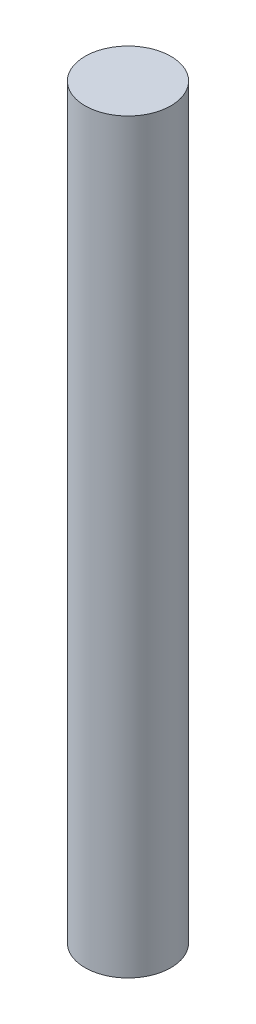
ISO-10303-21;
HEADER;
FILE_DESCRIPTION(('STEP AP214'),'2;1');
FILE_NAME('part.step','',(''),(''),'','','');
FILE_SCHEMA(('AUTOMOTIVE_DESIGN { 1 0 10303 214 1 1 1 1 }'));
ENDSEC;
DATA;
#1=APPLICATION_CONTEXT('core data for automotive mechanical design processes');
#2=APPLICATION_PROTOCOL_DEFINITION('international standard','automotive_design',2000,#1);
#3=PRODUCT_CONTEXT('',#1,'mechanical');
#4=PRODUCT('Part','Part','',(#3));
#5=PRODUCT_RELATED_PRODUCT_CATEGORY('part','',(#4));
#6=PRODUCT_DEFINITION_FORMATION('','',#4);
#7=PRODUCT_DEFINITION_CONTEXT('part definition',#1,'design');
#8=PRODUCT_DEFINITION('design','',#6,#7);
#9=PRODUCT_DEFINITION_SHAPE('','',#8);
#10=(LENGTH_UNIT() NAMED_UNIT(*) SI_UNIT(.MILLI.,.METRE.));
#11=(NAMED_UNIT(*) PLANE_ANGLE_UNIT() SI_UNIT($,.RADIAN.));
#12=(NAMED_UNIT(*) SI_UNIT($,.STERADIAN.) SOLID_ANGLE_UNIT());
#13=UNCERTAINTY_MEASURE_WITH_UNIT(LENGTH_MEASURE(1.E-05),#10,'distance_accuracy_value','');
#14=(GEOMETRIC_REPRESENTATION_CONTEXT(3) GLOBAL_UNCERTAINTY_ASSIGNED_CONTEXT((#13)) GLOBAL_UNIT_ASSIGNED_CONTEXT((#10,
#11,#12)) REPRESENTATION_CONTEXT('',''));
#15=CARTESIAN_POINT('',(0.,0.,0.));
#16=DIRECTION('',(0.,0.,1.));
#17=DIRECTION('',(1.,0.,0.));
#18=AXIS2_PLACEMENT_3D('',#15,#16,#17);
#19=CARTESIAN_POINT('',(0.,87.,0.));
#20=DIRECTION('',(0.,-1.,0.));
#21=DIRECTION('',(0.,0.,-1.));
#22=AXIS2_PLACEMENT_3D('',#19,#20,#21);
#23=CYLINDRICAL_SURFACE('',#22,5.);
#24=CARTESIAN_POINT('',(0.,87.,0.));
#25=DIRECTION('',(0.,1.,0.));
#26=DIRECTION('',(0.,0.,1.));
#27=AXIS2_PLACEMENT_3D('',#24,#25,#26);
#28=CIRCLE('',#27,5.);
#29=CARTESIAN_POINT('',(0.,87.,5.));
#30=VERTEX_POINT('',#29);
#31=EDGE_CURVE('E10',#30,#30,#28,.T.);
#32=ORIENTED_EDGE('',*,*,#31,.F.);
#33=EDGE_LOOP('',(#32));
#34=FACE_BOUND('',#33,.T.);
#35=CARTESIAN_POINT('',(0.,0.,0.));
#36=DIRECTION('',(0.,1.,0.));
#37=DIRECTION('',(0.,0.,1.));
#38=AXIS2_PLACEMENT_3D('',#35,#36,#37);
#39=CIRCLE('',#38,5.);
#40=CARTESIAN_POINT('',(0.,0.,5.));
#41=VERTEX_POINT('',#40);
#42=EDGE_CURVE('E36',#41,#41,#39,.T.);
#43=ORIENTED_EDGE('',*,*,#42,.T.);
#44=EDGE_LOOP('',(#43));
#45=FACE_BOUND('',#44,.T.);
#46=ADVANCED_FACE('F33',(#34,#45),#23,.T.);
#47=CARTESIAN_POINT('',(0.,87.,0.));
#48=DIRECTION('',(0.,1.,0.));
#49=DIRECTION('',(0.,0.,1.));
#50=AXIS2_PLACEMENT_3D('',#47,#48,#49);
#51=PLANE('',#50);
#52=ORIENTED_EDGE('',*,*,#31,.T.);
#53=EDGE_LOOP('',(#52));
#54=FACE_BOUND('',#53,.T.);
#55=ADVANCED_FACE('F48',(#54),#51,.T.);
#56=CARTESIAN_POINT('',(0.,0.,0.));
#57=DIRECTION('',(0.,1.,0.));
#58=DIRECTION('',(0.,0.,1.));
#59=AXIS2_PLACEMENT_3D('',#56,#57,#58);
#60=PLANE('',#59);
#61=ORIENTED_EDGE('',*,*,#42,.F.);
#62=EDGE_LOOP('',(#61));
#63=FACE_BOUND('',#62,.T.);
#64=ADVANCED_FACE('F46',(#63),#60,.F.);
#65=CLOSED_SHELL('',(#46,#55,#64));
#66=MANIFOLD_SOLID_BREP('B2',#65);
#67=ADVANCED_BREP_SHAPE_REPRESENTATION('',(#18,#66),#14);
#68=SHAPE_DEFINITION_REPRESENTATION(#9,#67);
ENDSEC;
END-ISO-10303-21;
